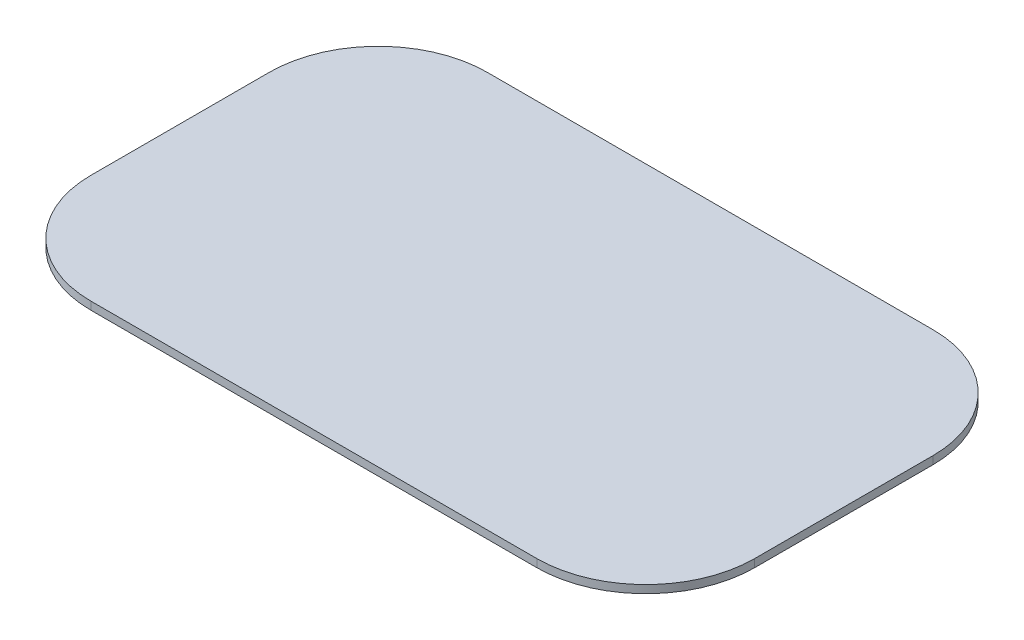
ISO-10303-21;
HEADER;
FILE_DESCRIPTION(('STEP AP214'),'2;1');
FILE_NAME('part.step','',(''),(''),'','','');
FILE_SCHEMA(('AUTOMOTIVE_DESIGN { 1 0 10303 214 1 1 1 1 }'));
ENDSEC;
DATA;
#1=APPLICATION_CONTEXT('core data for automotive mechanical design processes');
#2=APPLICATION_PROTOCOL_DEFINITION('international standard','automotive_design',2000,#1);
#3=PRODUCT_CONTEXT('',#1,'mechanical');
#4=PRODUCT('Part','Part','',(#3));
#5=PRODUCT_RELATED_PRODUCT_CATEGORY('part','',(#4));
#6=PRODUCT_DEFINITION_FORMATION('','',#4);
#7=PRODUCT_DEFINITION_CONTEXT('part definition',#1,'design');
#8=PRODUCT_DEFINITION('design','',#6,#7);
#9=PRODUCT_DEFINITION_SHAPE('','',#8);
#10=(LENGTH_UNIT() NAMED_UNIT(*) SI_UNIT(.MILLI.,.METRE.));
#11=(NAMED_UNIT(*) PLANE_ANGLE_UNIT() SI_UNIT($,.RADIAN.));
#12=(NAMED_UNIT(*) SI_UNIT($,.STERADIAN.) SOLID_ANGLE_UNIT());
#13=UNCERTAINTY_MEASURE_WITH_UNIT(LENGTH_MEASURE(1.E-05),#10,'distance_accuracy_value','');
#14=(GEOMETRIC_REPRESENTATION_CONTEXT(3) GLOBAL_UNCERTAINTY_ASSIGNED_CONTEXT((#13)) GLOBAL_UNIT_ASSIGNED_CONTEXT((#10,
#11,#12)) REPRESENTATION_CONTEXT('',''));
#15=CARTESIAN_POINT('',(0.,0.,0.));
#16=DIRECTION('',(0.,0.,1.));
#17=DIRECTION('',(1.,0.,0.));
#18=AXIS2_PLACEMENT_3D('',#15,#16,#17);
#19=CARTESIAN_POINT('',(55.,4.,-55.));
#20=DIRECTION('',(0.,-1.,0.));
#21=DIRECTION('',(0.,0.,-1.));
#22=AXIS2_PLACEMENT_3D('',#19,#20,#21);
#23=CYLINDRICAL_SURFACE('',#22,55.);
#24=CARTESIAN_POINT('',(55.,0.,-55.));
#25=DIRECTION('',(0.,1.,0.));
#26=DIRECTION('',(0.,0.,-1.));
#27=AXIS2_PLACEMENT_3D('',#24,#25,#26);
#28=CIRCLE('',#27,55.);
#29=CARTESIAN_POINT('',(0.,0.,-55.0000000000004));
#30=VERTEX_POINT('',#29);
#31=CARTESIAN_POINT('',(55.0000000000004,0.,0.));
#32=VERTEX_POINT('',#31);
#33=EDGE_CURVE('E131',#30,#32,#28,.T.);
#34=ORIENTED_EDGE('',*,*,#33,.T.);
#35=DIRECTION('',(0.,-1.,0.));
#36=VECTOR('',#35,1.);
#37=CARTESIAN_POINT('',(55.0000000000004,4.,0.));
#38=LINE('',#37,#36);
#39=CARTESIAN_POINT('',(55.0000000000004,4.,0.));
#40=VERTEX_POINT('',#39);
#41=EDGE_CURVE('E11',#40,#32,#38,.T.);
#42=ORIENTED_EDGE('',*,*,#41,.F.);
#43=CARTESIAN_POINT('',(55.,4.,-55.));
#44=DIRECTION('',(0.,1.,0.));
#45=DIRECTION('',(0.,0.,-1.));
#46=AXIS2_PLACEMENT_3D('',#43,#44,#45);
#47=CIRCLE('',#46,55.);
#48=CARTESIAN_POINT('',(0.,4.,-55.0000000000004));
#49=VERTEX_POINT('',#48);
#50=EDGE_CURVE('E145',#49,#40,#47,.T.);
#51=ORIENTED_EDGE('',*,*,#50,.F.);
#52=DIRECTION('',(0.,-1.,0.));
#53=VECTOR('',#52,1.);
#54=CARTESIAN_POINT('',(0.,4.,-55.0000000000004));
#55=LINE('',#54,#53);
#56=EDGE_CURVE('E127',#49,#30,#55,.T.);
#57=ORIENTED_EDGE('',*,*,#56,.T.);
#58=EDGE_LOOP('',(#34,#42,#51,#57));
#59=FACE_BOUND('',#58,.T.);
#60=ADVANCED_FACE('F35',(#59),#23,.T.);
#61=CARTESIAN_POINT('',(55.0000000000004,4.,0.));
#62=DIRECTION('',(0.,0.,-1.));
#63=DIRECTION('',(-1.,0.,0.));
#64=AXIS2_PLACEMENT_3D('',#61,#62,#63);
#65=PLANE('',#64);
#66=DIRECTION('',(1.,0.,0.));
#67=VECTOR('',#66,1.);
#68=CARTESIAN_POINT('',(55.0000000000004,0.,0.));
#69=LINE('',#68,#67);
#70=CARTESIAN_POINT('',(280.,0.,0.));
#71=VERTEX_POINT('',#70);
#72=EDGE_CURVE('E134',#32,#71,#69,.T.);
#73=ORIENTED_EDGE('',*,*,#72,.T.);
#74=DIRECTION('',(0.,-1.,0.));
#75=VECTOR('',#74,1.);
#76=CARTESIAN_POINT('',(280.,4.,0.));
#77=LINE('',#76,#75);
#78=CARTESIAN_POINT('',(280.,4.,0.));
#79=VERTEX_POINT('',#78);
#80=EDGE_CURVE('E43',#79,#71,#77,.T.);
#81=ORIENTED_EDGE('',*,*,#80,.F.);
#82=DIRECTION('',(1.,0.,0.));
#83=VECTOR('',#82,1.);
#84=CARTESIAN_POINT('',(55.0000000000004,4.,0.));
#85=LINE('',#84,#83);
#86=EDGE_CURVE('E94',#40,#79,#85,.T.);
#87=ORIENTED_EDGE('',*,*,#86,.F.);
#88=ORIENTED_EDGE('',*,*,#41,.T.);
#89=EDGE_LOOP('',(#73,#81,#87,#88));
#90=FACE_BOUND('',#89,.T.);
#91=ADVANCED_FACE('F180',(#90),#65,.F.);
#92=CARTESIAN_POINT('',(280.,4.,-55.));
#93=DIRECTION('',(0.,-1.,0.));
#94=DIRECTION('',(0.,0.,-1.));
#95=AXIS2_PLACEMENT_3D('',#92,#93,#94);
#96=CYLINDRICAL_SURFACE('',#95,55.);
#97=CARTESIAN_POINT('',(280.,0.,-55.));
#98=DIRECTION('',(0.,1.,0.));
#99=DIRECTION('',(0.,0.,1.));
#100=AXIS2_PLACEMENT_3D('',#97,#98,#99);
#101=CIRCLE('',#100,55.);
#102=CARTESIAN_POINT('',(335.,0.,-55.0000000000004));
#103=VERTEX_POINT('',#102);
#104=EDGE_CURVE('E136',#71,#103,#101,.T.);
#105=ORIENTED_EDGE('',*,*,#104,.T.);
#106=DIRECTION('',(0.,-1.,0.));
#107=VECTOR('',#106,1.);
#108=CARTESIAN_POINT('',(335.,4.,-55.0000000000004));
#109=LINE('',#108,#107);
#110=CARTESIAN_POINT('',(335.,4.,-55.0000000000004));
#111=VERTEX_POINT('',#110);
#112=EDGE_CURVE('E152',#111,#103,#109,.T.);
#113=ORIENTED_EDGE('',*,*,#112,.F.);
#114=CARTESIAN_POINT('',(280.,4.,-55.));
#115=DIRECTION('',(0.,1.,0.));
#116=DIRECTION('',(0.,0.,1.));
#117=AXIS2_PLACEMENT_3D('',#114,#115,#116);
#118=CIRCLE('',#117,55.);
#119=EDGE_CURVE('E160',#79,#111,#118,.T.);
#120=ORIENTED_EDGE('',*,*,#119,.F.);
#121=ORIENTED_EDGE('',*,*,#80,.T.);
#122=EDGE_LOOP('',(#105,#113,#120,#121));
#123=FACE_BOUND('',#122,.T.);
#124=ADVANCED_FACE('F158',(#123),#96,.T.);
#125=CARTESIAN_POINT('',(335.,4.,-55.0000000000004));
#126=DIRECTION('',(-1.,0.,0.));
#127=DIRECTION('',(0.,0.,1.));
#128=AXIS2_PLACEMENT_3D('',#125,#126,#127);
#129=PLANE('',#128);
#130=DIRECTION('',(0.,0.,-1.));
#131=VECTOR('',#130,1.);
#132=CARTESIAN_POINT('',(335.,0.,-55.0000000000004));
#133=LINE('',#132,#131);
#134=CARTESIAN_POINT('',(335.,0.,-145.));
#135=VERTEX_POINT('',#134);
#136=EDGE_CURVE('E138',#103,#135,#133,.T.);
#137=ORIENTED_EDGE('',*,*,#136,.T.);
#138=DIRECTION('',(0.,-1.,0.));
#139=VECTOR('',#138,1.);
#140=CARTESIAN_POINT('',(335.,4.,-145.));
#141=LINE('',#140,#139);
#142=CARTESIAN_POINT('',(335.,4.,-145.));
#143=VERTEX_POINT('',#142);
#144=EDGE_CURVE('E149',#143,#135,#141,.T.);
#145=ORIENTED_EDGE('',*,*,#144,.F.);
#146=DIRECTION('',(0.,0.,-1.));
#147=VECTOR('',#146,1.);
#148=CARTESIAN_POINT('',(335.,4.,-55.0000000000004));
#149=LINE('',#148,#147);
#150=EDGE_CURVE('E172',#111,#143,#149,.T.);
#151=ORIENTED_EDGE('',*,*,#150,.F.);
#152=ORIENTED_EDGE('',*,*,#112,.T.);
#153=EDGE_LOOP('',(#137,#145,#151,#152));
#154=FACE_BOUND('',#153,.T.);
#155=ADVANCED_FACE('F168',(#154),#129,.F.);
#156=CARTESIAN_POINT('',(280.,4.,-145.));
#157=DIRECTION('',(0.,-1.,0.));
#158=DIRECTION('',(0.,0.,-1.));
#159=AXIS2_PLACEMENT_3D('',#156,#157,#158);
#160=CYLINDRICAL_SURFACE('',#159,55.);
#161=CARTESIAN_POINT('',(280.,0.,-145.));
#162=DIRECTION('',(0.,1.,0.));
#163=DIRECTION('',(0.,0.,-1.));
#164=AXIS2_PLACEMENT_3D('',#161,#162,#163);
#165=CIRCLE('',#164,55.);
#166=CARTESIAN_POINT('',(280.,0.,-200.));
#167=VERTEX_POINT('',#166);
#168=EDGE_CURVE('E140',#135,#167,#165,.T.);
#169=ORIENTED_EDGE('',*,*,#168,.T.);
#170=DIRECTION('',(0.,-1.,0.));
#171=VECTOR('',#170,1.);
#172=CARTESIAN_POINT('',(280.,4.,-200.));
#173=LINE('',#172,#171);
#174=CARTESIAN_POINT('',(280.,4.,-200.));
#175=VERTEX_POINT('',#174);
#176=EDGE_CURVE('E122',#175,#167,#173,.T.);
#177=ORIENTED_EDGE('',*,*,#176,.F.);
#178=CARTESIAN_POINT('',(280.,4.,-145.));
#179=DIRECTION('',(0.,1.,0.));
#180=DIRECTION('',(0.,0.,-1.));
#181=AXIS2_PLACEMENT_3D('',#178,#179,#180);
#182=CIRCLE('',#181,55.);
#183=EDGE_CURVE('E113',#143,#175,#182,.T.);
#184=ORIENTED_EDGE('',*,*,#183,.F.);
#185=ORIENTED_EDGE('',*,*,#144,.T.);
#186=EDGE_LOOP('',(#169,#177,#184,#185));
#187=FACE_BOUND('',#186,.T.);
#188=ADVANCED_FACE('F171',(#187),#160,.T.);
#189=CARTESIAN_POINT('',(55.0000000000004,4.,-200.));
#190=DIRECTION('',(0.,0.,1.));
#191=DIRECTION('',(1.,0.,0.));
#192=AXIS2_PLACEMENT_3D('',#189,#190,#191);
#193=PLANE('',#192);
#194=DIRECTION('',(-1.,0.,0.));
#195=VECTOR('',#194,1.);
#196=CARTESIAN_POINT('',(55.0000000000004,0.,-200.));
#197=LINE('',#196,#195);
#198=CARTESIAN_POINT('',(55.0000000000004,0.,-200.));
#199=VERTEX_POINT('',#198);
#200=EDGE_CURVE('E121',#167,#199,#197,.T.);
#201=ORIENTED_EDGE('',*,*,#200,.T.);
#202=DIRECTION('',(0.,-1.,0.));
#203=VECTOR('',#202,1.);
#204=CARTESIAN_POINT('',(55.0000000000004,4.,-200.));
#205=LINE('',#204,#203);
#206=CARTESIAN_POINT('',(55.0000000000004,4.,-200.));
#207=VERTEX_POINT('',#206);
#208=EDGE_CURVE('E118',#207,#199,#205,.T.);
#209=ORIENTED_EDGE('',*,*,#208,.F.);
#210=DIRECTION('',(-1.,0.,0.));
#211=VECTOR('',#210,1.);
#212=CARTESIAN_POINT('',(55.0000000000004,4.,-200.));
#213=LINE('',#212,#211);
#214=EDGE_CURVE('E107',#175,#207,#213,.T.);
#215=ORIENTED_EDGE('',*,*,#214,.F.);
#216=ORIENTED_EDGE('',*,*,#176,.T.);
#217=EDGE_LOOP('',(#201,#209,#215,#216));
#218=FACE_BOUND('',#217,.T.);
#219=ADVANCED_FACE('F119',(#218),#193,.F.);
#220=CARTESIAN_POINT('',(55.,4.,-145.));
#221=DIRECTION('',(0.,-1.,0.));
#222=DIRECTION('',(0.,0.,-1.));
#223=AXIS2_PLACEMENT_3D('',#220,#221,#222);
#224=CYLINDRICAL_SURFACE('',#223,55.);
#225=CARTESIAN_POINT('',(55.,0.,-145.));
#226=DIRECTION('',(0.,1.,0.));
#227=DIRECTION('',(0.,0.,-1.));
#228=AXIS2_PLACEMENT_3D('',#225,#226,#227);
#229=CIRCLE('',#228,55.);
#230=CARTESIAN_POINT('',(0.,0.,-145.));
#231=VERTEX_POINT('',#230);
#232=EDGE_CURVE('E80',#199,#231,#229,.T.);
#233=ORIENTED_EDGE('',*,*,#232,.T.);
#234=DIRECTION('',(0.,-1.,0.));
#235=VECTOR('',#234,1.);
#236=CARTESIAN_POINT('',(0.,4.,-145.));
#237=LINE('',#236,#235);
#238=CARTESIAN_POINT('',(0.,4.,-145.));
#239=VERTEX_POINT('',#238);
#240=EDGE_CURVE('E123',#239,#231,#237,.T.);
#241=ORIENTED_EDGE('',*,*,#240,.F.);
#242=CARTESIAN_POINT('',(55.,4.,-145.));
#243=DIRECTION('',(0.,1.,0.));
#244=DIRECTION('',(0.,0.,-1.));
#245=AXIS2_PLACEMENT_3D('',#242,#243,#244);
#246=CIRCLE('',#245,55.);
#247=EDGE_CURVE('E111',#207,#239,#246,.T.);
#248=ORIENTED_EDGE('',*,*,#247,.F.);
#249=ORIENTED_EDGE('',*,*,#208,.T.);
#250=EDGE_LOOP('',(#233,#241,#248,#249));
#251=FACE_BOUND('',#250,.T.);
#252=ADVANCED_FACE('F125',(#251),#224,.T.);
#253=CARTESIAN_POINT('',(0.,4.,-55.0000000000004));
#254=DIRECTION('',(1.,0.,0.));
#255=DIRECTION('',(0.,0.,-1.));
#256=AXIS2_PLACEMENT_3D('',#253,#254,#255);
#257=PLANE('',#256);
#258=DIRECTION('',(0.,0.,1.));
#259=VECTOR('',#258,1.);
#260=CARTESIAN_POINT('',(0.,0.,-55.0000000000004));
#261=LINE('',#260,#259);
#262=EDGE_CURVE('E86',#231,#30,#261,.T.);
#263=ORIENTED_EDGE('',*,*,#262,.T.);
#264=ORIENTED_EDGE('',*,*,#56,.F.);
#265=DIRECTION('',(0.,0.,1.));
#266=VECTOR('',#265,1.);
#267=CARTESIAN_POINT('',(0.,4.,-55.0000000000004));
#268=LINE('',#267,#266);
#269=EDGE_CURVE('E51',#239,#49,#268,.T.);
#270=ORIENTED_EDGE('',*,*,#269,.F.);
#271=ORIENTED_EDGE('',*,*,#240,.T.);
#272=EDGE_LOOP('',(#263,#264,#270,#271));
#273=FACE_BOUND('',#272,.T.);
#274=ADVANCED_FACE('F196',(#273),#257,.F.);
#275=CARTESIAN_POINT('',(55.,4.,-55.));
#276=DIRECTION('',(0.,-1.,0.));
#277=DIRECTION('',(0.,0.,-1.));
#278=AXIS2_PLACEMENT_3D('',#275,#276,#277);
#279=PLANE('',#278);
#280=ORIENTED_EDGE('',*,*,#50,.T.);
#281=ORIENTED_EDGE('',*,*,#86,.T.);
#282=ORIENTED_EDGE('',*,*,#119,.T.);
#283=ORIENTED_EDGE('',*,*,#150,.T.);
#284=ORIENTED_EDGE('',*,*,#183,.T.);
#285=ORIENTED_EDGE('',*,*,#214,.T.);
#286=ORIENTED_EDGE('',*,*,#247,.T.);
#287=ORIENTED_EDGE('',*,*,#269,.T.);
#288=EDGE_LOOP('',(#280,#281,#282,#283,#284,#285,#286,#287));
#289=FACE_BOUND('',#288,.T.);
#290=ADVANCED_FACE('F109',(#289),#279,.F.);
#291=CARTESIAN_POINT('',(55.,0.,-55.));
#292=DIRECTION('',(0.,-1.,0.));
#293=DIRECTION('',(0.,0.,-1.));
#294=AXIS2_PLACEMENT_3D('',#291,#292,#293);
#295=PLANE('',#294);
#296=ORIENTED_EDGE('',*,*,#33,.F.);
#297=ORIENTED_EDGE('',*,*,#262,.F.);
#298=ORIENTED_EDGE('',*,*,#232,.F.);
#299=ORIENTED_EDGE('',*,*,#200,.F.);
#300=ORIENTED_EDGE('',*,*,#168,.F.);
#301=ORIENTED_EDGE('',*,*,#136,.F.);
#302=ORIENTED_EDGE('',*,*,#104,.F.);
#303=ORIENTED_EDGE('',*,*,#72,.F.);
#304=EDGE_LOOP('',(#296,#297,#298,#299,#300,#301,#302,#303));
#305=FACE_BOUND('',#304,.T.);
#306=ADVANCED_FACE('F164',(#305),#295,.T.);
#307=CLOSED_SHELL('',(#60,#91,#124,#155,#188,#219,#252,#274,#290,#306));
#308=MANIFOLD_SOLID_BREP('B2',#307);
#309=ADVANCED_BREP_SHAPE_REPRESENTATION('',(#18,#308),#14);
#310=SHAPE_DEFINITION_REPRESENTATION(#9,#309);
ENDSEC;
END-ISO-10303-21;
